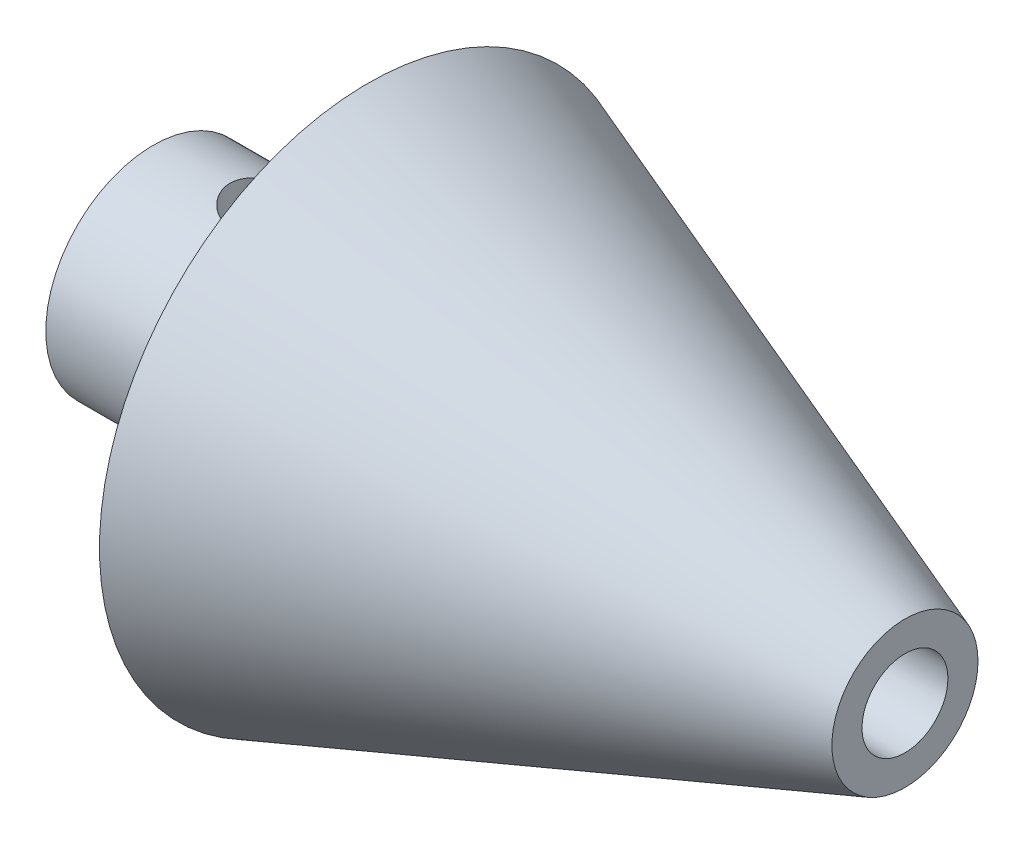
ISO-10303-21;
HEADER;
FILE_DESCRIPTION(('STEP AP214'),'2;1');
FILE_NAME('part.step','',(''),(''),'','','');
FILE_SCHEMA(('AUTOMOTIVE_DESIGN { 1 0 10303 214 1 1 1 1 }'));
ENDSEC;
DATA;
#1=APPLICATION_CONTEXT('core data for automotive mechanical design processes');
#2=APPLICATION_PROTOCOL_DEFINITION('international standard','automotive_design',2000,#1);
#3=PRODUCT_CONTEXT('',#1,'mechanical');
#4=PRODUCT('Part','Part','',(#3));
#5=PRODUCT_RELATED_PRODUCT_CATEGORY('part','',(#4));
#6=PRODUCT_DEFINITION_FORMATION('','',#4);
#7=PRODUCT_DEFINITION_CONTEXT('part definition',#1,'design');
#8=PRODUCT_DEFINITION('design','',#6,#7);
#9=PRODUCT_DEFINITION_SHAPE('','',#8);
#10=(LENGTH_UNIT() NAMED_UNIT(*) SI_UNIT(.MILLI.,.METRE.));
#11=(NAMED_UNIT(*) PLANE_ANGLE_UNIT() SI_UNIT($,.RADIAN.));
#12=(NAMED_UNIT(*) SI_UNIT($,.STERADIAN.) SOLID_ANGLE_UNIT());
#13=UNCERTAINTY_MEASURE_WITH_UNIT(LENGTH_MEASURE(1.E-05),#10,'distance_accuracy_value','');
#14=(GEOMETRIC_REPRESENTATION_CONTEXT(3) GLOBAL_UNCERTAINTY_ASSIGNED_CONTEXT((#13)) GLOBAL_UNIT_ASSIGNED_CONTEXT((#10,
#11,#12)) REPRESENTATION_CONTEXT('',''));
#15=CARTESIAN_POINT('',(0.,0.,0.));
#16=DIRECTION('',(0.,0.,1.));
#17=DIRECTION('',(1.,0.,0.));
#18=AXIS2_PLACEMENT_3D('',#15,#16,#17);
#19=CARTESIAN_POINT('',(20.,0.,0.));
#20=DIRECTION('',(-1.,0.,0.));
#21=DIRECTION('',(0.,0.,1.));
#22=AXIS2_PLACEMENT_3D('',#19,#20,#21);
#23=CYLINDRICAL_SURFACE('',#22,10.);
#24=CARTESIAN_POINT('',(10.,9.62756296533978,2.70370696422854));
#25=CARTESIAN_POINT('',(9.81615444890106,9.62756199903669,2.70370843104919));
#26=CARTESIAN_POINT('',(9.63231817071922,9.63192914230293,2.68830108314536));
#27=CARTESIAN_POINT('',(9.27010201178322,9.64873694006941,2.6273282694209));
#28=CARTESIAN_POINT('',(9.09172291187473,9.66117874433505,2.58175850870208));
#29=CARTESIAN_POINT('',(8.74572901865607,9.69229607045106,2.46234822666298));
#30=CARTESIAN_POINT('',(8.57809344360795,9.71095909595275,2.38856433471254));
#31=CARTESIAN_POINT('',(8.2572718678193,9.75197424492493,2.2151543537966));
#32=CARTESIAN_POINT('',(8.10408919944028,9.77432721592388,2.11552232486637));
#33=CARTESIAN_POINT('',(7.81036390282876,9.82064192516437,1.88912487937742));
#34=CARTESIAN_POINT('',(7.67048673187387,9.84463260364707,1.76150181376602));
#35=CARTESIAN_POINT('',(7.41332675602751,9.89014517378124,1.48481087413355));
#36=CARTESIAN_POINT('',(7.29604769132452,9.91166665652068,1.33573945733807));
#37=CARTESIAN_POINT('',(7.08437478027797,9.94962957397031,1.01562781647112));
#38=CARTESIAN_POINT('',(6.99068085467898,9.96591890101297,0.84410476674113));
#39=CARTESIAN_POINT('',(6.83347429385088,9.98972446553414,0.48717201463975));
#40=CARTESIAN_POINT('',(6.76995328972402,9.99724313652469,0.301766179396239));
#41=CARTESIAN_POINT('',(6.67716020222235,10.0014213288059,-0.070539605601831));
#42=CARTESIAN_POINT('',(6.64674756037786,9.99845853245291,-0.257150497893146));
#43=CARTESIAN_POINT('',(6.61740507545826,9.98175204341729,-0.63233551269438));
#44=CARTESIAN_POINT('',(6.61846690278535,9.96801120403965,-0.820909102578031));
#45=CARTESIAN_POINT('',(6.65132582394302,9.93098048224504,-1.18662258474652));
#46=CARTESIAN_POINT('',(6.68188348987915,9.90809742182337,-1.36391710774601));
#47=CARTESIAN_POINT('',(6.77081342860139,9.85425347562992,-1.71008468337349));
#48=CARTESIAN_POINT('',(6.82918759916951,9.82329203877585,-1.87895716053861));
#49=CARTESIAN_POINT('',(6.97280141882228,9.75504366807504,-2.20623274398559));
#50=CARTESIAN_POINT('',(7.0583886421618,9.71767795382996,-2.36446638741996));
#51=CARTESIAN_POINT('',(7.25371066140646,9.63976531591487,-2.66438935535157));
#52=CARTESIAN_POINT('',(7.36345229818484,9.59921749312402,-2.80607397549482));
#53=CARTESIAN_POINT('',(7.61018640115311,9.5161715600067,-3.07626802370375));
#54=CARTESIAN_POINT('',(7.74823866359027,9.47367379675632,-3.20381120639387));
#55=CARTESIAN_POINT('',(8.04449976816057,9.39253402619954,-3.43442669185719));
#56=CARTESIAN_POINT('',(8.20271188797789,9.35389264770808,-3.53749500757121));
#57=CARTESIAN_POINT('',(8.53793135607234,9.28373177118462,-3.71777612803904));
#58=CARTESIAN_POINT('',(8.71518492867398,9.2523277329741,-3.79457812891842));
#59=CARTESIAN_POINT('',(9.08154665379473,9.20091299007776,-3.91761395697807));
#60=CARTESIAN_POINT('',(9.2706496372382,9.18089735530719,-3.96386101291426));
#61=CARTESIAN_POINT('',(9.64598477006625,9.15528330375142,-4.02265765804142));
#62=CARTESIAN_POINT('',(9.83194601449776,9.14906161241285,-4.0366651742661));
#63=CARTESIAN_POINT('',(10.2036638512733,9.14990463762248,-4.03475565341015));
#64=CARTESIAN_POINT('',(10.3894204755217,9.1569668563148,-4.01884424217097));
#65=CARTESIAN_POINT('',(10.748554848497,9.18306754158608,-3.95882099284448));
#66=CARTESIAN_POINT('',(10.922137852565,9.2016705254684,-3.91573367360695));
#67=CARTESIAN_POINT('',(11.2593684933262,9.24853069760327,-3.8037271144822));
#68=CARTESIAN_POINT('',(11.4230143326301,9.27678962628987,-3.7348032174681));
#69=CARTESIAN_POINT('',(11.741596739797,9.34131485701209,-3.57041350725973));
#70=CARTESIAN_POINT('',(11.8960800392487,9.37781070862628,-3.47416089093907));
#71=CARTESIAN_POINT('',(12.1868504167705,9.45489121733849,-3.25854570860485));
#72=CARTESIAN_POINT('',(12.3231319704121,9.49547710928029,-3.13917615315858));
#73=CARTESIAN_POINT('',(12.5806237499298,9.57931877217064,-2.87349413110014));
#74=CARTESIAN_POINT('',(12.7007502922477,9.62260707996784,-2.72613850427128));
#75=CARTESIAN_POINT('',(12.914195257313,9.70603047485976,-2.4123214088452));
#76=CARTESIAN_POINT('',(13.0075145538181,9.7461656646965,-2.24586056321276));
#77=CARTESIAN_POINT('',(13.163858016241,9.81958981469733,-1.89916226744578));
#78=CARTESIAN_POINT('',(13.2270726770559,9.85292104001674,-1.71902004005083));
#79=CARTESIAN_POINT('',(13.3217185107791,9.91033168276667,-1.34917843256077));
#80=CARTESIAN_POINT('',(13.3531615029213,9.93441453857263,-1.15948263403686));
#81=CARTESIAN_POINT('',(13.3822851419249,9.97076847296037,-0.785709546770147));
#82=CARTESIAN_POINT('',(13.3815196008966,9.9835527796931,-0.601801955538685));
#83=CARTESIAN_POINT('',(13.3500976414171,9.99888561524864,-0.236145414032057));
#84=CARTESIAN_POINT('',(13.3194437595489,10.0014350126004,-0.0543962818963025));
#85=CARTESIAN_POINT('',(13.2301538776572,9.99707307701779,0.298694725035262));
#86=CARTESIAN_POINT('',(13.1719932858479,9.99031888433631,0.470159646851155));
#87=CARTESIAN_POINT('',(13.0297840644305,9.9692134731532,0.801480272897993));
#88=CARTESIAN_POINT('',(12.9457307112064,9.95486086812968,0.961333852290759));
#89=CARTESIAN_POINT('',(12.7504910002777,9.92013073030271,1.27132003770266));
#90=CARTESIAN_POINT('',(12.6384039630571,9.89954711535617,1.42086186127157));
#91=CARTESIAN_POINT('',(12.3917986364146,9.85550561687532,1.69969763521414));
#92=CARTESIAN_POINT('',(12.2572730925929,9.83204680443832,1.82898501099769));
#93=CARTESIAN_POINT('',(11.9630961333059,9.78445975735329,2.0687958875669));
#94=CARTESIAN_POINT('',(11.8026475671604,9.76034290745572,2.17834695951864));
#95=CARTESIAN_POINT('',(11.464955310165,9.71594374686621,2.36854848209805));
#96=CARTESIAN_POINT('',(11.2877154506856,9.69566056457165,2.44920550566819));
#97=CARTESIAN_POINT('',(10.9279423294145,9.66264569400585,2.57632753822338));
#98=CARTESIAN_POINT('',(10.7458330565436,9.64966718612232,2.62392476704686));
#99=CARTESIAN_POINT('',(10.3758111755195,9.63212787550777,2.68760789093577));
#100=CARTESIAN_POINT('',(10.187900744507,9.62756395295721,2.70370546505333));
#101=CARTESIAN_POINT('',(10.,9.62756296533978,2.70370696422854));
#102=B_SPLINE_CURVE_WITH_KNOTS('',3,(#24,#25,#26,#27,#28,#29,#30,#31,#32,#33,#34,#35,#36,#37,
#38,#39,#40,#41,#42,#43,#44,#45,#46,#47,#48,#49,#50,#51,#52,#53,#54,#55,#56,#57,#58,#59,#60,#61,
#62,#63,#64,#65,#66,#67,#68,#69,#70,#71,#72,#73,#74,#75,#76,#77,#78,#79,#80,#81,#82,#83,#84,#85,
#86,#87,#88,#89,#90,#91,#92,#93,#94,#95,#96,#97,#98,#99,#100,#101),.UNSPECIFIED.,.T.,.F.,(4,2,2,
2,2,2,2,2,2,2,2,2,2,2,2,2,2,2,2,2,2,2,2,2,2,2,2,2,2,2,2,2,2,2,2,2,2,2,4),(0.,0.550840423403521,
1.10175929917246,1.65157816559794,2.20152349382641,2.77154224673842,3.34165526196262,
3.9270934602699,4.51236918384133,5.07677362995702,5.64102870993006,6.18256129686089,
6.72413083516253,7.27291585497148,7.82185649894785,8.39729767000523,8.9728325186488,
9.55699603254943,10.1409064669765,10.6978438979125,11.2546766149224,11.7916781492124,
12.3287765263512,12.8832573949465,13.4379061739424,14.0200824324507,14.6022397133,
15.1806626166248,15.7588702641691,16.3092173965215,16.8595178257239,17.400636627687,
17.9418542044676,18.5034036164233,19.065134931219,19.6496245924943,20.2339812069862,
20.7971807091833,21.3601713556437),.UNSPECIFIED.);
#103=CARTESIAN_POINT('',(10.,9.62756296533978,2.70370696422854));
#104=VERTEX_POINT('',#103);
#105=EDGE_CURVE('E53',#104,#104,#102,.T.);
#106=ORIENTED_EDGE('',*,*,#105,.T.);
#107=EDGE_LOOP('',(#106));
#108=FACE_BOUND('',#107,.T.);
#109=CARTESIAN_POINT('',(20.,0.,0.));
#110=DIRECTION('',(1.,0.,0.));
#111=DIRECTION('',(0.,0.,-1.));
#112=AXIS2_PLACEMENT_3D('',#109,#110,#111);
#113=CIRCLE('',#112,10.);
#114=CARTESIAN_POINT('',(20.,0.,-10.));
#115=VERTEX_POINT('',#114);
#116=EDGE_CURVE('E10',#115,#115,#113,.T.);
#117=ORIENTED_EDGE('',*,*,#116,.F.);
#118=EDGE_LOOP('',(#117));
#119=FACE_BOUND('',#118,.T.);
#120=CARTESIAN_POINT('',(0.,0.,0.));
#121=DIRECTION('',(1.,0.,0.));
#122=DIRECTION('',(0.,0.,-1.));
#123=AXIS2_PLACEMENT_3D('',#120,#121,#122);
#124=CIRCLE('',#123,10.);
#125=CARTESIAN_POINT('',(0.,0.,-10.));
#126=VERTEX_POINT('',#125);
#127=EDGE_CURVE('E35',#126,#126,#124,.T.);
#128=ORIENTED_EDGE('',*,*,#127,.T.);
#129=EDGE_LOOP('',(#128));
#130=FACE_BOUND('',#129,.T.);
#131=ADVANCED_FACE('F31',(#108,#119,#130),#23,.T.);
#132=CARTESIAN_POINT('',(0.,0.,0.));
#133=DIRECTION('',(1.,0.,0.));
#134=DIRECTION('',(0.,0.,-1.));
#135=AXIS2_PLACEMENT_3D('',#132,#133,#134);
#136=PLANE('',#135);
#137=CARTESIAN_POINT('',(0.,0.,0.));
#138=DIRECTION('',(1.,0.,0.));
#139=DIRECTION('',(0.,0.,-1.));
#140=AXIS2_PLACEMENT_3D('',#137,#138,#139);
#141=CIRCLE('',#140,4.);
#142=CARTESIAN_POINT('',(0.,0.,-4.));
#143=VERTEX_POINT('',#142);
#144=EDGE_CURVE('E49',#143,#143,#141,.T.);
#145=ORIENTED_EDGE('',*,*,#144,.T.);
#146=EDGE_LOOP('',(#145));
#147=FACE_BOUND('',#146,.T.);
#148=ORIENTED_EDGE('',*,*,#127,.F.);
#149=EDGE_LOOP('',(#148));
#150=FACE_BOUND('',#149,.T.);
#151=ADVANCED_FACE('F84',(#147,#150),#136,.F.);
#152=CARTESIAN_POINT('',(20.,0.,0.));
#153=DIRECTION('',(1.,0.,0.));
#154=DIRECTION('',(0.,0.,-1.));
#155=AXIS2_PLACEMENT_3D('',#152,#153,#154);
#156=PLANE('',#155);
#157=CARTESIAN_POINT('',(20.,0.,0.));
#158=DIRECTION('',(1.,0.,0.));
#159=DIRECTION('',(0.,0.,-1.));
#160=AXIS2_PLACEMENT_3D('',#157,#158,#159);
#161=CIRCLE('',#160,25.);
#162=CARTESIAN_POINT('',(20.,0.,-25.));
#163=VERTEX_POINT('',#162);
#164=EDGE_CURVE('E46',#163,#163,#161,.T.);
#165=ORIENTED_EDGE('',*,*,#164,.F.);
#166=EDGE_LOOP('',(#165));
#167=FACE_BOUND('',#166,.T.);
#168=ORIENTED_EDGE('',*,*,#116,.T.);
#169=EDGE_LOOP('',(#168));
#170=FACE_BOUND('',#169,.T.);
#171=ADVANCED_FACE('F81',(#167,#170),#156,.F.);
#172=CARTESIAN_POINT('',(20.,0.,0.));
#173=DIRECTION('',(-1.,0.,0.));
#174=DIRECTION('',(0.,0.,-1.));
#175=AXIS2_PLACEMENT_3D('',#172,#173,#174);
#176=CONICAL_SURFACE('',#175,25.,0.349065850398867);
#177=CARTESIAN_POINT('',(70.,0.,0.));
#178=DIRECTION('',(1.,0.,0.));
#179=DIRECTION('',(0.,0.,-1.));
#180=AXIS2_PLACEMENT_3D('',#177,#178,#179);
#181=CIRCLE('',#180,6.80148828668984);
#182=CARTESIAN_POINT('',(70.,0.,-6.80148828668984));
#183=VERTEX_POINT('',#182);
#184=EDGE_CURVE('E42',#183,#183,#181,.T.);
#185=CARTESIAN_POINT('',(70.,0.,-6.80148828668984));
#186=CARTESIAN_POINT('',(69.4791666666667,0.,-6.99105611703682));
#187=CARTESIAN_POINT('',(68.9583333333333,0.,-7.1806239473838));
#188=CARTESIAN_POINT('',(67.9166666666667,0.,-7.55975960807776));
#189=CARTESIAN_POINT('',(67.3958333333333,0.,-7.74932743842474));
#190=CARTESIAN_POINT('',(66.3541666666667,0.,-8.12846309911871));
#191=CARTESIAN_POINT('',(65.8333333333333,0.,-8.31803092946569));
#192=CARTESIAN_POINT('',(64.7916666666667,0.,-8.69716659015965));
#193=CARTESIAN_POINT('',(64.2708333333333,0.,-8.88673442050663));
#194=CARTESIAN_POINT('',(63.2291666666667,0.,-9.26587008120059));
#195=CARTESIAN_POINT('',(62.7083333333333,0.,-9.45543791154757));
#196=CARTESIAN_POINT('',(61.6666666666667,0.,-9.83457357224153));
#197=CARTESIAN_POINT('',(61.1458333333333,0.,-10.0241414025885));
#198=CARTESIAN_POINT('',(60.1041666666667,0.,-10.4032770632825));
#199=CARTESIAN_POINT('',(59.5833333333333,0.,-10.5928448936295));
#200=CARTESIAN_POINT('',(58.5416666666667,0.,-10.9719805543234));
#201=CARTESIAN_POINT('',(58.0208333333333,0.,-11.1615483846704));
#202=CARTESIAN_POINT('',(56.9791666666667,0.,-11.5406840453644));
#203=CARTESIAN_POINT('',(56.4583333333333,0.,-11.7302518757113));
#204=CARTESIAN_POINT('',(55.4166666666667,0.,-12.1093875364053));
#205=CARTESIAN_POINT('',(54.8958333333333,0.,-12.2989553667523));
#206=CARTESIAN_POINT('',(53.8541666666667,0.,-12.6780910274462));
#207=CARTESIAN_POINT('',(53.3333333333333,0.,-12.8676588577932));
#208=CARTESIAN_POINT('',(52.2916666666667,0.,-13.2467945184872));
#209=CARTESIAN_POINT('',(51.7708333333333,0.,-13.4363623488342));
#210=CARTESIAN_POINT('',(50.7291666666667,0.,-13.8154980095281));
#211=CARTESIAN_POINT('',(50.2083333333333,0.,-14.0050658398751));
#212=CARTESIAN_POINT('',(49.1666666666667,0.,-14.3842015005691));
#213=CARTESIAN_POINT('',(48.6458333333333,0.,-14.5737693309161));
#214=CARTESIAN_POINT('',(47.6041666666667,0.,-14.95290499161));
#215=CARTESIAN_POINT('',(47.0833333333333,0.,-15.142472821957));
#216=CARTESIAN_POINT('',(46.0416666666667,0.,-15.521608482651));
#217=CARTESIAN_POINT('',(45.5208333333333,0.,-15.7111763129979));
#218=CARTESIAN_POINT('',(44.4791666666667,0.,-16.0903119736919));
#219=CARTESIAN_POINT('',(43.9583333333333,0.,-16.2798798040389));
#220=CARTESIAN_POINT('',(42.9166666666667,0.,-16.6590154647328));
#221=CARTESIAN_POINT('',(42.3958333333333,0.,-16.8485832950798));
#222=CARTESIAN_POINT('',(41.3541666666667,0.,-17.2277189557738));
#223=CARTESIAN_POINT('',(40.8333333333333,0.,-17.4172867861208));
#224=CARTESIAN_POINT('',(39.7916666666667,0.,-17.7964224468147));
#225=CARTESIAN_POINT('',(39.2708333333333,0.,-17.9859902771617));
#226=CARTESIAN_POINT('',(38.2291666666667,0.,-18.3651259378557));
#227=CARTESIAN_POINT('',(37.7083333333333,0.,-18.5546937682027));
#228=CARTESIAN_POINT('',(36.6666666666667,0.,-18.9338294288966));
#229=CARTESIAN_POINT('',(36.1458333333333,0.,-19.1233972592436));
#230=CARTESIAN_POINT('',(35.1041666666667,0.,-19.5025329199376));
#231=CARTESIAN_POINT('',(34.5833333333333,0.,-19.6921007502845));
#232=CARTESIAN_POINT('',(33.5416666666667,0.,-20.0712364109785));
#233=CARTESIAN_POINT('',(33.0208333333333,0.,-20.2608042413255));
#234=CARTESIAN_POINT('',(31.9791666666667,0.,-20.6399399020194));
#235=CARTESIAN_POINT('',(31.4583333333333,0.,-20.8295077323664));
#236=CARTESIAN_POINT('',(30.4166666666667,0.,-21.2086433930604));
#237=CARTESIAN_POINT('',(29.8958333333333,0.,-21.3982112234074));
#238=CARTESIAN_POINT('',(28.8541666666667,0.,-21.7773468841013));
#239=CARTESIAN_POINT('',(28.3333333333333,0.,-21.9669147144483));
#240=CARTESIAN_POINT('',(27.2916666666667,0.,-22.3460503751423));
#241=CARTESIAN_POINT('',(26.7708333333333,0.,-22.5356182054892));
#242=CARTESIAN_POINT('',(25.7291666666667,0.,-22.9147538661832));
#243=CARTESIAN_POINT('',(25.2083333333333,0.,-23.1043216965302));
#244=CARTESIAN_POINT('',(24.1666666666667,0.,-23.4834573572242));
#245=CARTESIAN_POINT('',(23.6458333333333,0.,-23.6730251875711));
#246=CARTESIAN_POINT('',(22.6041666666667,0.,-24.0521608482651));
#247=CARTESIAN_POINT('',(22.0833333333333,0.,-24.2417286786121));
#248=CARTESIAN_POINT('',(21.0416666666667,0.,-24.620864339306));
#249=CARTESIAN_POINT('',(20.5208333333333,0.,-24.810432169653));
#250=CARTESIAN_POINT('',(20.,0.,-25.));
#251=B_SPLINE_CURVE_WITH_KNOTS('',3,(#185,#186,#187,#188,#189,#190,#191,#192,#193,#194,#195,
#196,#197,#198,#199,#200,#201,#202,#203,#204,#205,#206,#207,#208,#209,#210,#211,#212,#213,#214,
#215,#216,#217,#218,#219,#220,#221,#222,#223,#224,#225,#226,#227,#228,#229,#230,#231,#232,#233,
#234,#235,#236,#237,#238,#239,#240,#241,#242,#243,#244,#245,#246,#247,#248,#249,#250),
.UNSPECIFIED.,.F.,.F.,(4,2,2,2,2,2,2,2,2,2,2,2,2,2,2,2,2,2,2,2,2,2,2,2,2,2,2,2,2,2,2,2,4),(0.,
1.66277776949362,3.32555553898723,4.98833330848084,6.65111107797446,8.31388884746806,
9.97666661696169,11.6394443864553,13.3022221559489,14.9649999254425,16.6277776949361,
18.2905554644298,19.9533332339234,21.616111003417,23.2788887729106,24.9416665424042,
26.6044443118978,28.2672220813914,29.929999850885,31.5927776203787,33.2555553898723,
34.9183331593659,36.5811109288595,38.2438886983531,39.9066664678467,41.5694442373403,
43.2322220068339,44.8949997763276,46.5577775458212,48.2205553153148,49.8833330848084,
51.546110854302,53.2088886237956),.UNSPECIFIED.);
#252=EDGE_CURVE('BSEAM79',#183,#163,#251,.T.);
#253=ORIENTED_EDGE('',*,*,#184,.F.);
#254=ORIENTED_EDGE('',*,*,#164,.T.);
#255=ORIENTED_EDGE('',*,*,#252,.T.);
#256=ORIENTED_EDGE('',*,*,#252,.F.);
#257=EDGE_LOOP('',(#253,#255,#254,#256));
#258=FACE_BOUND('',#257,.T.);
#259=ADVANCED_FACE('F79',(#258),#176,.T.);
#260=CARTESIAN_POINT('',(70.,0.,0.));
#261=DIRECTION('',(1.,0.,0.));
#262=DIRECTION('',(0.,0.,-1.));
#263=AXIS2_PLACEMENT_3D('',#260,#261,#262);
#264=PLANE('',#263);
#265=CARTESIAN_POINT('',(70.,0.,0.));
#266=DIRECTION('',(1.,0.,0.));
#267=DIRECTION('',(0.,0.,-1.));
#268=AXIS2_PLACEMENT_3D('',#265,#266,#267);
#269=CIRCLE('',#268,4.);
#270=CARTESIAN_POINT('',(70.,0.,-4.));
#271=VERTEX_POINT('',#270);
#272=EDGE_CURVE('E50',#271,#271,#269,.T.);
#273=ORIENTED_EDGE('',*,*,#272,.F.);
#274=EDGE_LOOP('',(#273));
#275=FACE_BOUND('',#274,.T.);
#276=ORIENTED_EDGE('',*,*,#184,.T.);
#277=EDGE_LOOP('',(#276));
#278=FACE_BOUND('',#277,.T.);
#279=ADVANCED_FACE('F75',(#275,#278),#264,.T.);
#280=CARTESIAN_POINT('',(0.,0.,0.));
#281=DIRECTION('',(1.,0.,0.));
#282=DIRECTION('',(0.,0.,-1.));
#283=AXIS2_PLACEMENT_3D('',#280,#281,#282);
#284=CYLINDRICAL_SURFACE('',#283,4.);
#285=CARTESIAN_POINT('',(10.,2.37558743107212,3.21816474987409));
#286=CARTESIAN_POINT('',(10.0583614419841,2.37558674814693,3.21816509606691));
#287=CARTESIAN_POINT('',(10.1167193631417,2.37787270238516,3.21648198809162));
#288=CARTESIAN_POINT('',(10.2329131274172,2.38687018836991,3.20980972604984));
#289=CARTESIAN_POINT('',(10.2907487491322,2.39358351512477,3.2048192310514));
#290=CARTESIAN_POINT('',(10.4630190631808,2.41990565994824,3.18505295413634));
#291=CARTESIAN_POINT('',(10.5759935231385,2.44569454314171,3.1654831896463));
#292=CARTESIAN_POINT('',(10.8399377640361,2.52203406749294,3.10523319281489));
#293=CARTESIAN_POINT('',(10.9879080783027,2.578372600103,3.05922743262093));
#294=CARTESIAN_POINT('',(11.2716999702413,2.70328702587129,2.94943895518145));
#295=CARTESIAN_POINT('',(11.4074804958493,2.77190210056709,2.88559894111783));
#296=CARTESIAN_POINT('',(11.63379302887,2.89539348359055,2.76085308003412));
#297=CARTESIAN_POINT('',(11.7269116192319,2.94920412532952,2.70349906114771));
#298=CARTESIAN_POINT('',(11.9072183696092,3.05740929327081,2.58049519057906));
#299=CARTESIAN_POINT('',(11.9944038061971,3.11180407451647,2.51484156821285));
#300=CARTESIAN_POINT('',(12.16269760157,3.21942177406118,2.37551417080905));
#301=CARTESIAN_POINT('',(12.2438126560788,3.27264593639292,2.30184945897955));
#302=CARTESIAN_POINT('',(12.3997824661843,3.37655664793208,2.14653283083802));
#303=CARTESIAN_POINT('',(12.4746365721365,3.42724293358753,2.06488008757952));
#304=CARTESIAN_POINT('',(12.6579496838134,3.55228802089154,1.84526414661933));
#305=CARTESIAN_POINT('',(12.7615383404302,3.62386663261116,1.7015242232396));
#306=CARTESIAN_POINT('',(12.9486842062914,3.75225752769413,1.39569914850183));
#307=CARTESIAN_POINT('',(13.0322747345162,3.8090943858527,1.23364518313928));
#308=CARTESIAN_POINT('',(13.1625206666796,3.89457964718885,0.923754955629782));
#309=CARTESIAN_POINT('',(13.2130922372805,3.92643397574399,0.778464287128627));
#310=CARTESIAN_POINT('',(13.2951350213075,3.97396221896511,0.480003044716901));
#311=CARTESIAN_POINT('',(13.3266172700384,3.98964548560584,0.326837079084458));
#312=CARTESIAN_POINT('',(13.3685353776862,4.00300006179283,0.0161169381483698));
#313=CARTESIAN_POINT('',(13.3788775164964,4.00059138399019,-0.141453652113149));
#314=CARTESIAN_POINT('',(13.3774534932335,3.97713544363082,-0.455098663265967));
#315=CARTESIAN_POINT('',(13.3656887121719,3.95608934539054,-0.611173177004457));
#316=CARTESIAN_POINT('',(13.3225576969355,3.89878403230579,-0.905758636092845));
#317=CARTESIAN_POINT('',(13.2926576537796,3.86372403799896,-1.04472646278001));
#318=CARTESIAN_POINT('',(13.2162904465113,3.78067782226961,-1.31390029974946));
#319=CARTESIAN_POINT('',(13.1698207540421,3.73268962841115,-1.44410496925838));
#320=CARTESIAN_POINT('',(13.0580423623175,3.62190938267244,-1.70390960625531));
#321=CARTESIAN_POINT('',(12.9915083331689,3.55823042519051,-1.83259812070024));
#322=CARTESIAN_POINT('',(12.8441137229855,3.4218388077545,-2.07619115501844));
#323=CARTESIAN_POINT('',(12.7632413785824,3.34911874509023,-2.19108422609308));
#324=CARTESIAN_POINT('',(12.546608031591,3.16047409791278,-2.45964690170724));
#325=CARTESIAN_POINT('',(12.4033600673761,3.04082905289784,-2.60475837098341));
#326=CARTESIAN_POINT('',(12.1714639751068,2.85870941485325,-2.79923924644297));
#327=CARTESIAN_POINT('',(12.0911938857928,2.79746643966393,-2.86027631233387));
#328=CARTESIAN_POINT('',(11.9250832146214,2.67545268013399,-2.97471780209332));
#329=CARTESIAN_POINT('',(11.8392445088264,2.61468174441043,-3.02812477731481));
#330=CARTESIAN_POINT('',(11.6162870625637,2.46433779342748,-3.15290216363339));
#331=CARTESIAN_POINT('',(11.4754859088759,2.37601347127769,-3.21939858812686));
#332=CARTESIAN_POINT('',(11.254048759275,2.25297656209452,-3.30554575143551));
#333=CARTESIAN_POINT('',(11.1786027633426,2.21357033019619,-3.33197758422602));
#334=CARTESIAN_POINT('',(11.0240760372057,2.1393095180709,-3.38013363672431));
#335=CARTESIAN_POINT('',(10.9449973483115,2.10445242285349,-3.40186046201392));
#336=CARTESIAN_POINT('',(10.7602882598905,2.032072135203,-3.44571387908439));
#337=CARTESIAN_POINT('',(10.6534497876805,1.99656045952195,-3.46623141438762));
#338=CARTESIAN_POINT('',(10.4347211305936,1.94036281047908,-3.49800831578317));
#339=CARTESIAN_POINT('',(10.3228442257878,1.91964003926413,-3.50929067127827));
#340=CARTESIAN_POINT('',(10.0955423455438,1.89658415289579,-3.52181404118631));
#341=CARTESIAN_POINT('',(9.98009502936892,1.89441190125241,-3.52296722144374));
#342=CARTESIAN_POINT('',(9.75078883012614,1.90936609956147,-3.51487853332371));
#343=CARTESIAN_POINT('',(9.63693198465844,1.92651535094102,-3.50562438321382));
#344=CARTESIAN_POINT('',(9.38983291374545,1.98226444104734,-3.47445189749549));
#345=CARTESIAN_POINT('',(9.25779879819021,2.02473617612422,-3.45020597402734));
#346=CARTESIAN_POINT('',(9.00270164540182,2.12520856585785,-3.38923540859596));
#347=CARTESIAN_POINT('',(8.87967111368983,2.18326226473598,-3.35246802386771));
#348=CARTESIAN_POINT('',(8.66503259684795,2.29646729012646,-3.27567014931279));
#349=CARTESIAN_POINT('',(8.57188719408712,2.35008502694341,-3.23757732312922));
#350=CARTESIAN_POINT('',(8.3910222623727,2.46086536084698,-3.15419523145535));
#351=CARTESIAN_POINT('',(8.30330588692089,2.51802998028126,-3.10890183695092));
#352=CARTESIAN_POINT('',(8.13302030282651,2.63414182383872,-3.01115745406644));
#353=CARTESIAN_POINT('',(8.05045780163118,2.69309122852987,-2.95869741047924));
#354=CARTESIAN_POINT('',(7.89058431911307,2.81127962987036,-2.84663646915448));
#355=CARTESIAN_POINT('',(7.81327224050869,2.87051856322,-2.78703707070575));
#356=CARTESIAN_POINT('',(7.6613579076777,2.99022161190349,-2.65830354389423));
#357=CARTESIAN_POINT('',(7.58695490462708,3.05065250776134,-2.58890245862474));
#358=CARTESIAN_POINT('',(7.44437976582146,3.16931434979557,-2.44220202181127));
#359=CARTESIAN_POINT('',(7.37620881428891,3.22754487662684,-2.3649011750303));
#360=CARTESIAN_POINT('',(7.24694464875434,3.34041591115806,-2.2025807586255));
#361=CARTESIAN_POINT('',(7.18583293841033,3.39506563048675,-2.1175824517549));
#362=CARTESIAN_POINT('',(7.07138028819936,3.49964373244486,-1.93987768907504));
#363=CARTESIAN_POINT('',(7.01803506502448,3.54957471214138,-1.84717552668694));
#364=CARTESIAN_POINT('',(6.90269646394164,3.66011294345781,-1.62007530043207));
#365=CARTESIAN_POINT('',(6.84434371926904,3.71822797889431,-1.48254800015213));
#366=CARTESIAN_POINT('',(6.74656513630312,3.82005691031169,-1.19593309462613));
#367=CARTESIAN_POINT('',(6.70712487402419,3.86378177323803,-1.04685440040845));
#368=CARTESIAN_POINT('',(6.64943580140181,3.93417317109565,-0.739734272525115));
#369=CARTESIAN_POINT('',(6.63130931409164,3.96074084983867,-0.581646510812187));
#370=CARTESIAN_POINT('',(6.61805621557346,3.99460110905773,-0.262470974807601));
#371=CARTESIAN_POINT('',(6.62292383885958,4.00189852061385,-0.101383962632162));
#372=CARTESIAN_POINT('',(6.65381017028305,3.99745463661129,0.204036993322764));
#373=CARTESIAN_POINT('',(6.67792896311834,3.987332982298,0.34859726155868));
#374=CARTESIAN_POINT('',(6.7434773796638,3.95236015121061,0.631848022218924));
#375=CARTESIAN_POINT('',(6.78491125467881,3.92750535643822,0.770537063887696));
#376=CARTESIAN_POINT('',(6.8857137409919,3.86338830109096,1.04661265632699));
#377=CARTESIAN_POINT('',(6.94593460408986,3.82341650859095,1.18351887252897));
#378=CARTESIAN_POINT('',(7.08080607920034,3.73215238966106,1.44581158287233));
#379=CARTESIAN_POINT('',(7.1554594546605,3.6808578949635,1.57119586407126));
#380=CARTESIAN_POINT('',(7.35607752435764,3.5428554501865,1.86710643028561));
#381=CARTESIAN_POINT('',(7.48943808452963,3.45099000564582,2.03028919896182));
#382=CARTESIAN_POINT('',(7.70629354937827,3.30569982296415,2.25396525934495));
#383=CARTESIAN_POINT('',(7.7816154754611,3.25587120480315,2.32517684655369));
#384=CARTESIAN_POINT('',(7.93762881676337,3.15490577498836,2.46042014215502));
#385=CARTESIAN_POINT('',(8.01831792721197,3.10376953058726,2.52445490109961));
#386=CARTESIAN_POINT('',(8.1866048129347,3.00051726218512,2.64639466279482));
#387=CARTESIAN_POINT('',(8.27430632214792,2.94840149579517,2.70415647933706));
#388=CARTESIAN_POINT('',(8.45542972641346,2.84585666998595,2.81187219388334));
#389=CARTESIAN_POINT('',(8.54885507218008,2.79542865695226,2.86182131610724));
#390=CARTESIAN_POINT('',(8.7412436906611,2.69880956139721,2.95310315013502));
#391=CARTESIAN_POINT('',(8.84017514917761,2.65259753111425,2.9944799261365));
#392=CARTESIAN_POINT('',(9.04419782601764,2.56723646322679,3.06797280364445));
#393=CARTESIAN_POINT('',(9.14927903342942,2.52807634777745,3.10010347817959));
#394=CARTESIAN_POINT('',(9.37582502745073,2.45773340134441,3.15623122837224));
#395=CARTESIAN_POINT('',(9.49790761020152,2.42761637273579,3.17920765094761));
#396=CARTESIAN_POINT('',(9.68450716099612,2.39676850099749,3.20244542585865));
#397=CARTESIAN_POINT('',(9.7471894692173,2.38887498341496,3.20831976510851));
#398=CARTESIAN_POINT('',(9.87324929478828,2.37828514807146,3.21617899306445));
#399=CARTESIAN_POINT('',(9.93662672314356,2.37558817264406,3.21816437395169));
#400=CARTESIAN_POINT('',(10.,2.37558743107212,3.21816474987409));
#401=B_SPLINE_CURVE_WITH_KNOTS('',3,(#285,#286,#287,#288,#289,#290,#291,#292,#293,#294,#295,
#296,#297,#298,#299,#300,#301,#302,#303,#304,#305,#306,#307,#308,#309,#310,#311,#312,#313,#314,
#315,#316,#317,#318,#319,#320,#321,#322,#323,#324,#325,#326,#327,#328,#329,#330,#331,#332,#333,
#334,#335,#336,#337,#338,#339,#340,#341,#342,#343,#344,#345,#346,#347,#348,#349,#350,#351,#352,
#353,#354,#355,#356,#357,#358,#359,#360,#361,#362,#363,#364,#365,#366,#367,#368,#369,#370,#371,
#372,#373,#374,#375,#376,#377,#378,#379,#380,#381,#382,#383,#384,#385,#386,#387,#388,#389,#390,
#391,#392,#393,#394,#395,#396,#397,#398,#399,#400),.UNSPECIFIED.,.T.,.F.,(4,2,2,2,2,2,2,2,2,2,2,
2,2,2,2,2,2,2,2,2,2,2,2,2,2,2,2,2,2,2,2,2,2,2,2,2,2,2,2,2,2,2,2,2,2,2,2,2,2,2,2,2,2,2,2,2,2,4),
(0.,0.175007980725952,0.350086959333689,0.700905426724996,1.19286214265671,1.68641793305999,
2.05166346294202,2.41707553194497,2.78207841633305,3.14711912704977,3.71813412036832,
4.28819101189105,4.75754442789027,5.22662625706433,5.69778318798807,6.16891068688425,
6.60625202841066,7.04366013227159,7.51666321033567,7.99005615820142,8.69523718516774,
9.04889653638166,9.40243735265522,9.93767214544953,10.2048104508299,10.4718004374502,
10.8139460344101,11.1552373057251,11.499485160131,11.8441396895001,12.2641923107097,
12.6856934233517,13.0273450957014,13.3691933923939,13.7114776866865,14.0536902257139,
14.4082843773229,14.762945769918,15.1166557380959,15.4701698860779,15.9490350470514,
16.4275344086943,16.9087667518453,17.3898784379874,17.8286320753998,18.2674935016383,
18.730203495907,19.1930021749108,19.8786997246219,20.2234816577968,20.5681164791365,
20.9194439689078,21.2709853874644,21.6206723164755,21.9698050373852,22.3510681085157,
22.5411290930601,22.7311660221966),.UNSPECIFIED.);
#402=CARTESIAN_POINT('',(10.,2.37558743107212,3.21816474987409));
#403=VERTEX_POINT('',#402);
#404=EDGE_CURVE('E61',#403,#403,#401,.T.);
#405=ORIENTED_EDGE('',*,*,#404,.T.);
#406=EDGE_LOOP('',(#405));
#407=FACE_BOUND('',#406,.T.);
#408=ORIENTED_EDGE('',*,*,#144,.F.);
#409=EDGE_LOOP('',(#408));
#410=FACE_BOUND('',#409,.T.);
#411=ORIENTED_EDGE('',*,*,#272,.T.);
#412=EDGE_LOOP('',(#411));
#413=FACE_BOUND('',#412,.T.);
#414=ADVANCED_FACE('F68',(#407,#410,#413),#284,.F.);
#415=CARTESIAN_POINT('',(10.,9.97493190111665,-0.707625302038724));
#416=DIRECTION('',(0.,0.997493190111665,-0.0707625302038724));
#417=DIRECTION('',(0.,0.0707625302038724,0.997493190111665));
#418=AXIS2_PLACEMENT_3D('',#415,#416,#417);
#419=CYLINDRICAL_SURFACE('',#418,3.37819999999999);
#420=ORIENTED_EDGE('',*,*,#404,.F.);
#421=EDGE_LOOP('',(#420));
#422=FACE_BOUND('',#421,.T.);
#423=ORIENTED_EDGE('',*,*,#105,.F.);
#424=EDGE_LOOP('',(#423));
#425=FACE_BOUND('',#424,.T.);
#426=ADVANCED_FACE('F65',(#422,#425),#419,.F.);
#427=CLOSED_SHELL('',(#131,#151,#171,#259,#279,#414,#426));
#428=MANIFOLD_SOLID_BREP('B2',#427);
#429=ADVANCED_BREP_SHAPE_REPRESENTATION('',(#18,#428),#14);
#430=SHAPE_DEFINITION_REPRESENTATION(#9,#429);
ENDSEC;
END-ISO-10303-21;
